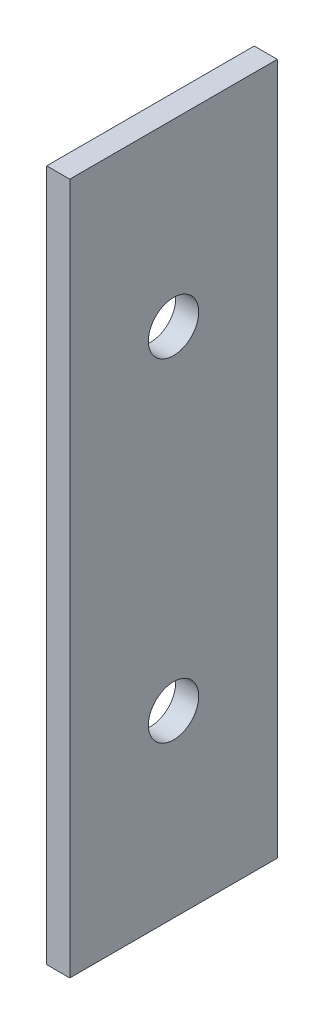
ISO-10303-21;
HEADER;
FILE_DESCRIPTION(('STEP AP214'),'2;1');
FILE_NAME('part.step','',(''),(''),'','','');
FILE_SCHEMA(('AUTOMOTIVE_DESIGN { 1 0 10303 214 1 1 1 1 }'));
ENDSEC;
DATA;
#1=APPLICATION_CONTEXT('core data for automotive mechanical design processes');
#2=APPLICATION_PROTOCOL_DEFINITION('international standard','automotive_design',2000,#1);
#3=PRODUCT_CONTEXT('',#1,'mechanical');
#4=PRODUCT('Part','Part','',(#3));
#5=PRODUCT_RELATED_PRODUCT_CATEGORY('part','',(#4));
#6=PRODUCT_DEFINITION_FORMATION('','',#4);
#7=PRODUCT_DEFINITION_CONTEXT('part definition',#1,'design');
#8=PRODUCT_DEFINITION('design','',#6,#7);
#9=PRODUCT_DEFINITION_SHAPE('','',#8);
#10=(LENGTH_UNIT() NAMED_UNIT(*) SI_UNIT(.MILLI.,.METRE.));
#11=(NAMED_UNIT(*) PLANE_ANGLE_UNIT() SI_UNIT($,.RADIAN.));
#12=(NAMED_UNIT(*) SI_UNIT($,.STERADIAN.) SOLID_ANGLE_UNIT());
#13=UNCERTAINTY_MEASURE_WITH_UNIT(LENGTH_MEASURE(1.E-05),#10,'distance_accuracy_value','');
#14=(GEOMETRIC_REPRESENTATION_CONTEXT(3) GLOBAL_UNCERTAINTY_ASSIGNED_CONTEXT((#13)) GLOBAL_UNIT_ASSIGNED_CONTEXT((#10,
#11,#12)) REPRESENTATION_CONTEXT('',''));
#15=CARTESIAN_POINT('',(0.,0.,0.));
#16=DIRECTION('',(0.,0.,1.));
#17=DIRECTION('',(1.,0.,0.));
#18=AXIS2_PLACEMENT_3D('',#15,#16,#17);
#19=CARTESIAN_POINT('',(3.12924372930912,0.,9.));
#20=DIRECTION('',(1.,0.,0.));
#21=DIRECTION('',(0.,1.,0.));
#22=AXIS2_PLACEMENT_3D('',#19,#20,#21);
#23=PLANE('',#22);
#24=CARTESIAN_POINT('',(3.12924372930912,-15.1574699599649,4.5));
#25=DIRECTION('',(1.,0.,0.));
#26=DIRECTION('',(0.,-1.,0.));
#27=AXIS2_PLACEMENT_3D('',#24,#25,#26);
#28=CIRCLE('',#27,1.0922);
#29=CARTESIAN_POINT('',(3.12924372930912,-16.2496699599649,4.5));
#30=VERTEX_POINT('',#29);
#31=EDGE_CURVE('E122',#30,#30,#28,.T.);
#32=ORIENTED_EDGE('',*,*,#31,.F.);
#33=EDGE_LOOP('',(#32));
#34=FACE_BOUND('',#33,.T.);
#35=CARTESIAN_POINT('',(3.12924372930912,-0.727469959964931,4.5));
#36=DIRECTION('',(1.,0.,0.));
#37=DIRECTION('',(0.,1.,0.));
#38=AXIS2_PLACEMENT_3D('',#35,#36,#37);
#39=CIRCLE('',#38,1.0922);
#40=CARTESIAN_POINT('',(3.12924372930912,0.36473004003507,4.5));
#41=VERTEX_POINT('',#40);
#42=EDGE_CURVE('E115',#41,#41,#39,.T.);
#43=ORIENTED_EDGE('',*,*,#42,.F.);
#44=EDGE_LOOP('',(#43));
#45=FACE_BOUND('',#44,.T.);
#46=DIRECTION('',(0.,-1.,0.));
#47=VECTOR('',#46,1.);
#48=CARTESIAN_POINT('',(3.12924372930912,0.,0.));
#49=LINE('',#48,#47);
#50=CARTESIAN_POINT('',(3.12924372930911,7.05753004003507,0.));
#51=VERTEX_POINT('',#50);
#52=CARTESIAN_POINT('',(3.12924372930912,-22.9424699599649,0.));
#53=VERTEX_POINT('',#52);
#54=EDGE_CURVE('E106',#51,#53,#49,.T.);
#55=ORIENTED_EDGE('',*,*,#54,.F.);
#56=DIRECTION('',(0.,0.,-1.));
#57=VECTOR('',#56,1.);
#58=CARTESIAN_POINT('',(3.12924372930911,7.05753004003507,9.));
#59=LINE('',#58,#57);
#60=CARTESIAN_POINT('',(3.12924372930911,7.05753004003507,9.));
#61=VERTEX_POINT('',#60);
#62=EDGE_CURVE('E11',#61,#51,#59,.T.);
#63=ORIENTED_EDGE('',*,*,#62,.F.);
#64=DIRECTION('',(0.,-1.,0.));
#65=VECTOR('',#64,1.);
#66=CARTESIAN_POINT('',(3.12924372930912,0.,9.));
#67=LINE('',#66,#65);
#68=CARTESIAN_POINT('',(3.12924372930912,-22.9424699599649,9.));
#69=VERTEX_POINT('',#68);
#70=EDGE_CURVE('E99',#61,#69,#67,.T.);
#71=ORIENTED_EDGE('',*,*,#70,.T.);
#72=DIRECTION('',(0.,0.,-1.));
#73=VECTOR('',#72,1.);
#74=CARTESIAN_POINT('',(3.12924372930912,-22.9424699599649,9.));
#75=LINE('',#74,#73);
#76=EDGE_CURVE('E79',#69,#53,#75,.T.);
#77=ORIENTED_EDGE('',*,*,#76,.T.);
#78=EDGE_LOOP('',(#55,#63,#71,#77));
#79=FACE_BOUND('',#78,.T.);
#80=ADVANCED_FACE('F39',(#34,#45,#79),#23,.T.);
#81=CARTESIAN_POINT('',(0.,7.05753004003507,9.));
#82=DIRECTION('',(0.,1.,0.));
#83=DIRECTION('',(0.,0.,1.));
#84=AXIS2_PLACEMENT_3D('',#81,#82,#83);
#85=PLANE('',#84);
#86=DIRECTION('',(1.,0.,0.));
#87=VECTOR('',#86,1.);
#88=CARTESIAN_POINT('',(0.,7.05753004003507,0.));
#89=LINE('',#88,#87);
#90=CARTESIAN_POINT('',(2.12924372930911,7.05753004003507,0.));
#91=VERTEX_POINT('',#90);
#92=EDGE_CURVE('E92',#91,#51,#89,.T.);
#93=ORIENTED_EDGE('',*,*,#92,.F.);
#94=DIRECTION('',(0.,0.,-1.));
#95=VECTOR('',#94,1.);
#96=CARTESIAN_POINT('',(2.12924372930911,7.05753004003507,9.));
#97=LINE('',#96,#95);
#98=CARTESIAN_POINT('',(2.12924372930911,7.05753004003507,9.));
#99=VERTEX_POINT('',#98);
#100=EDGE_CURVE('E48',#99,#91,#97,.T.);
#101=ORIENTED_EDGE('',*,*,#100,.F.);
#102=DIRECTION('',(1.,0.,0.));
#103=VECTOR('',#102,1.);
#104=CARTESIAN_POINT('',(0.,7.05753004003507,9.));
#105=LINE('',#104,#103);
#106=EDGE_CURVE('E90',#99,#61,#105,.T.);
#107=ORIENTED_EDGE('',*,*,#106,.T.);
#108=ORIENTED_EDGE('',*,*,#62,.T.);
#109=EDGE_LOOP('',(#93,#101,#107,#108));
#110=FACE_BOUND('',#109,.T.);
#111=ADVANCED_FACE('F88',(#110),#85,.T.);
#112=CARTESIAN_POINT('',(2.12924372930912,0.,9.));
#113=DIRECTION('',(1.,0.,0.));
#114=DIRECTION('',(0.,1.,0.));
#115=AXIS2_PLACEMENT_3D('',#112,#113,#114);
#116=PLANE('',#115);
#117=CARTESIAN_POINT('',(2.12924372930912,-15.1574699599649,4.5));
#118=DIRECTION('',(1.,0.,0.));
#119=DIRECTION('',(0.,1.,0.));
#120=AXIS2_PLACEMENT_3D('',#117,#118,#119);
#121=CIRCLE('',#120,1.0922);
#122=CARTESIAN_POINT('',(2.12924372930912,-14.0652699599649,4.5));
#123=VERTEX_POINT('',#122);
#124=EDGE_CURVE('E42',#123,#123,#121,.T.);
#125=ORIENTED_EDGE('',*,*,#124,.T.);
#126=EDGE_LOOP('',(#125));
#127=FACE_BOUND('',#126,.T.);
#128=CARTESIAN_POINT('',(2.12924372930912,-0.727469959964931,4.5));
#129=DIRECTION('',(1.,0.,0.));
#130=DIRECTION('',(0.,1.,0.));
#131=AXIS2_PLACEMENT_3D('',#128,#129,#130);
#132=CIRCLE('',#131,1.0922);
#133=CARTESIAN_POINT('',(2.12924372930912,0.36473004003507,4.5));
#134=VERTEX_POINT('',#133);
#135=EDGE_CURVE('E109',#134,#134,#132,.T.);
#136=ORIENTED_EDGE('',*,*,#135,.T.);
#137=EDGE_LOOP('',(#136));
#138=FACE_BOUND('',#137,.T.);
#139=DIRECTION('',(0.,-1.,0.));
#140=VECTOR('',#139,1.);
#141=CARTESIAN_POINT('',(2.12924372930912,0.,0.));
#142=LINE('',#141,#140);
#143=CARTESIAN_POINT('',(2.12924372930912,-22.9424699599649,0.));
#144=VERTEX_POINT('',#143);
#145=EDGE_CURVE('E72',#91,#144,#142,.T.);
#146=ORIENTED_EDGE('',*,*,#145,.T.);
#147=DIRECTION('',(0.,0.,-1.));
#148=VECTOR('',#147,1.);
#149=CARTESIAN_POINT('',(2.12924372930912,-22.9424699599649,9.));
#150=LINE('',#149,#148);
#151=CARTESIAN_POINT('',(2.12924372930912,-22.9424699599649,9.));
#152=VERTEX_POINT('',#151);
#153=EDGE_CURVE('E93',#152,#144,#150,.T.);
#154=ORIENTED_EDGE('',*,*,#153,.F.);
#155=DIRECTION('',(0.,-1.,0.));
#156=VECTOR('',#155,1.);
#157=CARTESIAN_POINT('',(2.12924372930912,0.,9.));
#158=LINE('',#157,#156);
#159=EDGE_CURVE('E95',#99,#152,#158,.T.);
#160=ORIENTED_EDGE('',*,*,#159,.F.);
#161=ORIENTED_EDGE('',*,*,#100,.T.);
#162=EDGE_LOOP('',(#146,#154,#160,#161));
#163=FACE_BOUND('',#162,.T.);
#164=ADVANCED_FACE('F96',(#127,#138,#163),#116,.F.);
#165=CARTESIAN_POINT('',(0.,-22.9424699599649,9.));
#166=DIRECTION('',(0.,1.,0.));
#167=DIRECTION('',(0.,0.,1.));
#168=AXIS2_PLACEMENT_3D('',#165,#166,#167);
#169=PLANE('',#168);
#170=DIRECTION('',(1.,0.,0.));
#171=VECTOR('',#170,1.);
#172=CARTESIAN_POINT('',(0.,-22.9424699599649,0.));
#173=LINE('',#172,#171);
#174=EDGE_CURVE('E101',#144,#53,#173,.T.);
#175=ORIENTED_EDGE('',*,*,#174,.T.);
#176=ORIENTED_EDGE('',*,*,#76,.F.);
#177=DIRECTION('',(1.,0.,0.));
#178=VECTOR('',#177,1.);
#179=CARTESIAN_POINT('',(0.,-22.9424699599649,9.));
#180=LINE('',#179,#178);
#181=EDGE_CURVE('E57',#152,#69,#180,.T.);
#182=ORIENTED_EDGE('',*,*,#181,.F.);
#183=ORIENTED_EDGE('',*,*,#153,.T.);
#184=EDGE_LOOP('',(#175,#176,#182,#183));
#185=FACE_BOUND('',#184,.T.);
#186=ADVANCED_FACE('F136',(#185),#169,.F.);
#187=CARTESIAN_POINT('',(0.,0.,9.));
#188=DIRECTION('',(0.,0.,1.));
#189=DIRECTION('',(1.,0.,0.));
#190=AXIS2_PLACEMENT_3D('',#187,#188,#189);
#191=PLANE('',#190);
#192=ORIENTED_EDGE('',*,*,#70,.F.);
#193=ORIENTED_EDGE('',*,*,#106,.F.);
#194=ORIENTED_EDGE('',*,*,#159,.T.);
#195=ORIENTED_EDGE('',*,*,#181,.T.);
#196=EDGE_LOOP('',(#192,#193,#194,#195));
#197=FACE_BOUND('',#196,.T.);
#198=ADVANCED_FACE('F98',(#197),#191,.T.);
#199=CARTESIAN_POINT('',(0.,0.,0.));
#200=DIRECTION('',(0.,0.,1.));
#201=DIRECTION('',(1.,0.,0.));
#202=AXIS2_PLACEMENT_3D('',#199,#200,#201);
#203=PLANE('',#202);
#204=ORIENTED_EDGE('',*,*,#54,.T.);
#205=ORIENTED_EDGE('',*,*,#174,.F.);
#206=ORIENTED_EDGE('',*,*,#145,.F.);
#207=ORIENTED_EDGE('',*,*,#92,.T.);
#208=EDGE_LOOP('',(#204,#205,#206,#207));
#209=FACE_BOUND('',#208,.T.);
#210=ADVANCED_FACE('F134',(#209),#203,.F.);
#211=CARTESIAN_POINT('',(-6.87075627069088,-0.727469959964932,4.5));
#212=DIRECTION('',(1.,0.,0.));
#213=DIRECTION('',(0.,1.,0.));
#214=AXIS2_PLACEMENT_3D('',#211,#212,#213);
#215=CYLINDRICAL_SURFACE('',#214,1.0922);
#216=ORIENTED_EDGE('',*,*,#42,.T.);
#217=EDGE_LOOP('',(#216));
#218=FACE_BOUND('',#217,.T.);
#219=ORIENTED_EDGE('',*,*,#135,.F.);
#220=EDGE_LOOP('',(#219));
#221=FACE_BOUND('',#220,.T.);
#222=ADVANCED_FACE('F165',(#218,#221),#215,.F.);
#223=CARTESIAN_POINT('',(-6.87075627069088,-15.1574699599649,4.5));
#224=DIRECTION('',(1.,0.,0.));
#225=DIRECTION('',(0.,1.,0.));
#226=AXIS2_PLACEMENT_3D('',#223,#224,#225);
#227=CYLINDRICAL_SURFACE('',#226,1.0922);
#228=ORIENTED_EDGE('',*,*,#31,.T.);
#229=EDGE_LOOP('',(#228));
#230=FACE_BOUND('',#229,.T.);
#231=ORIENTED_EDGE('',*,*,#124,.F.);
#232=EDGE_LOOP('',(#231));
#233=FACE_BOUND('',#232,.T.);
#234=ADVANCED_FACE('F127',(#230,#233),#227,.F.);
#235=CLOSED_SHELL('',(#80,#111,#164,#186,#198,#210,#222,#234));
#236=MANIFOLD_SOLID_BREP('B2',#235);
#237=ADVANCED_BREP_SHAPE_REPRESENTATION('',(#18,#236),#14);
#238=SHAPE_DEFINITION_REPRESENTATION(#9,#237);
ENDSEC;
END-ISO-10303-21;
